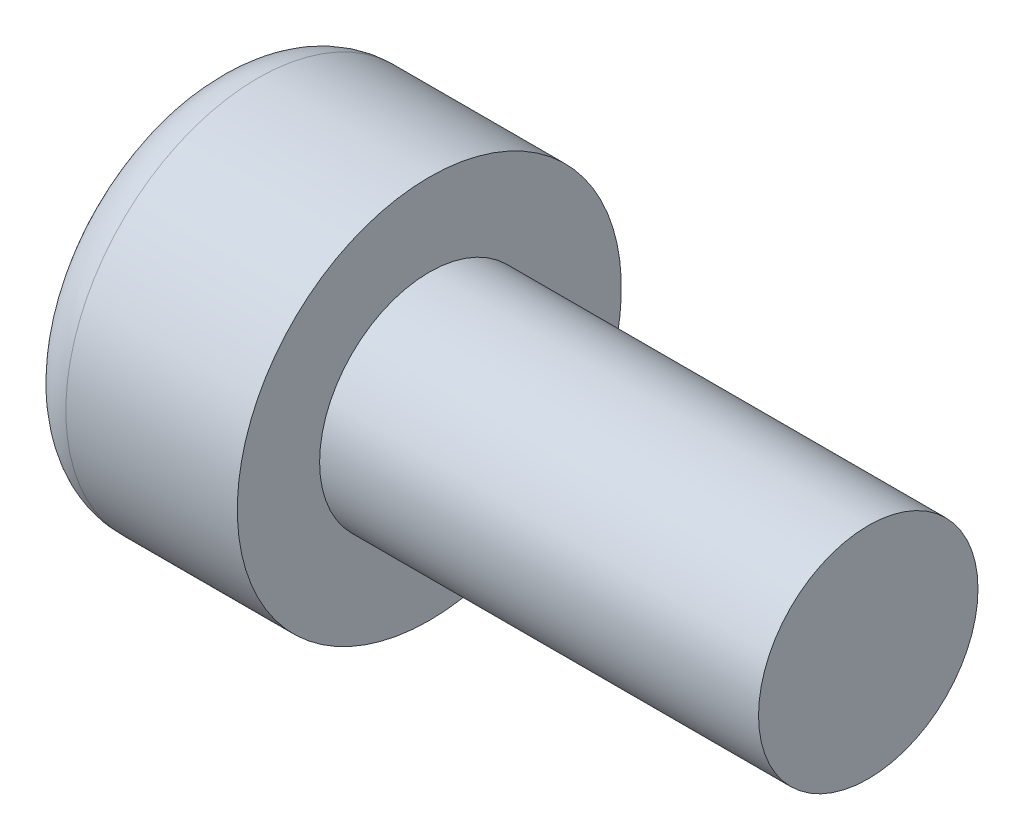
ISO-10303-21;
HEADER;
FILE_DESCRIPTION(('STEP AP214'),'2;1');
FILE_NAME('part.step','',(''),(''),'','','');
FILE_SCHEMA(('AUTOMOTIVE_DESIGN { 1 0 10303 214 1 1 1 1 }'));
ENDSEC;
DATA;
#1=APPLICATION_CONTEXT('core data for automotive mechanical design processes');
#2=APPLICATION_PROTOCOL_DEFINITION('international standard','automotive_design',2000,#1);
#3=PRODUCT_CONTEXT('',#1,'mechanical');
#4=PRODUCT('Part','Part','',(#3));
#5=PRODUCT_RELATED_PRODUCT_CATEGORY('part','',(#4));
#6=PRODUCT_DEFINITION_FORMATION('','',#4);
#7=PRODUCT_DEFINITION_CONTEXT('part definition',#1,'design');
#8=PRODUCT_DEFINITION('design','',#6,#7);
#9=PRODUCT_DEFINITION_SHAPE('','',#8);
#10=(LENGTH_UNIT() NAMED_UNIT(*) SI_UNIT(.MILLI.,.METRE.));
#11=(NAMED_UNIT(*) PLANE_ANGLE_UNIT() SI_UNIT($,.RADIAN.));
#12=(NAMED_UNIT(*) SI_UNIT($,.STERADIAN.) SOLID_ANGLE_UNIT());
#13=UNCERTAINTY_MEASURE_WITH_UNIT(LENGTH_MEASURE(1.E-05),#10,'distance_accuracy_value','');
#14=(GEOMETRIC_REPRESENTATION_CONTEXT(3) GLOBAL_UNCERTAINTY_ASSIGNED_CONTEXT((#13)) GLOBAL_UNIT_ASSIGNED_CONTEXT((#10,
#11,#12)) REPRESENTATION_CONTEXT('',''));
#15=CARTESIAN_POINT('',(0.,0.,0.));
#16=DIRECTION('',(0.,0.,1.));
#17=DIRECTION('',(1.,0.,0.));
#18=AXIS2_PLACEMENT_3D('',#15,#16,#17);
#19=CARTESIAN_POINT('',(0.,0.,0.));
#20=DIRECTION('',(1.,0.,0.));
#21=DIRECTION('',(0.,1.,0.));
#22=AXIS2_PLACEMENT_3D('',#19,#20,#21);
#23=PLANE('',#22);
#24=DIRECTION('',(0.,-0.5,-0.866025403784439));
#25=VECTOR('',#24,1.);
#26=CARTESIAN_POINT('',(0.,1.73205080756888,0.));
#27=LINE('',#26,#25);
#28=CARTESIAN_POINT('',(0.,1.73205080756888,0.));
#29=VERTEX_POINT('',#28);
#30=CARTESIAN_POINT('',(0.,0.866025403784439,-1.5));
#31=VERTEX_POINT('',#30);
#32=EDGE_CURVE('E121',#29,#31,#27,.T.);
#33=ORIENTED_EDGE('',*,*,#32,.F.);
#34=DIRECTION('',(0.,0.5,-0.866025403784439));
#35=VECTOR('',#34,1.);
#36=CARTESIAN_POINT('',(0.,0.866025403784439,1.5));
#37=LINE('',#36,#35);
#38=CARTESIAN_POINT('',(0.,0.866025403784439,1.5));
#39=VERTEX_POINT('',#38);
#40=EDGE_CURVE('E47',#39,#29,#37,.T.);
#41=ORIENTED_EDGE('',*,*,#40,.F.);
#42=DIRECTION('',(0.,1.,0.));
#43=VECTOR('',#42,1.);
#44=CARTESIAN_POINT('',(0.,-0.866025403784439,1.5));
#45=LINE('',#44,#43);
#46=CARTESIAN_POINT('',(0.,-0.866025403784439,1.5));
#47=VERTEX_POINT('',#46);
#48=EDGE_CURVE('E130',#47,#39,#45,.T.);
#49=ORIENTED_EDGE('',*,*,#48,.F.);
#50=DIRECTION('',(0.,0.5,0.866025403784439));
#51=VECTOR('',#50,1.);
#52=CARTESIAN_POINT('',(0.,-1.73205080756888,0.));
#53=LINE('',#52,#51);
#54=CARTESIAN_POINT('',(0.,-1.73205080756888,0.));
#55=VERTEX_POINT('',#54);
#56=EDGE_CURVE('E128',#55,#47,#53,.T.);
#57=ORIENTED_EDGE('',*,*,#56,.F.);
#58=DIRECTION('',(0.,-0.5,0.866025403784439));
#59=VECTOR('',#58,1.);
#60=CARTESIAN_POINT('',(0.,-0.866025403784439,-1.5));
#61=LINE('',#60,#59);
#62=CARTESIAN_POINT('',(0.,-0.866025403784439,-1.5));
#63=VERTEX_POINT('',#62);
#64=EDGE_CURVE('E95',#63,#55,#61,.T.);
#65=ORIENTED_EDGE('',*,*,#64,.F.);
#66=DIRECTION('',(0.,-1.,0.));
#67=VECTOR('',#66,1.);
#68=CARTESIAN_POINT('',(0.,0.866025403784439,-1.5));
#69=LINE('',#68,#67);
#70=EDGE_CURVE('E124',#31,#63,#69,.T.);
#71=ORIENTED_EDGE('',*,*,#70,.F.);
#72=EDGE_LOOP('',(#33,#41,#49,#57,#65,#71));
#73=FACE_BOUND('',#72,.T.);
#74=CARTESIAN_POINT('',(0.,0.,0.));
#75=DIRECTION('',(-1.,0.,0.));
#76=DIRECTION('',(0.,-1.,0.));
#77=AXIS2_PLACEMENT_3D('',#74,#75,#76);
#78=CIRCLE('',#77,2.625);
#79=CARTESIAN_POINT('',(0.,-2.625,0.));
#80=VERTEX_POINT('',#79);
#81=EDGE_CURVE('E11',#80,#80,#78,.T.);
#82=ORIENTED_EDGE('',*,*,#81,.T.);
#83=EDGE_LOOP('',(#82));
#84=FACE_BOUND('',#83,.T.);
#85=ADVANCED_FACE('F33',(#73,#84),#23,.F.);
#86=CARTESIAN_POINT('',(0.875,0.,0.));
#87=DIRECTION('',(-1.,0.,0.));
#88=DIRECTION('',(0.,-1.,0.));
#89=AXIS2_PLACEMENT_3D('',#86,#87,#88);
#90=TOROIDAL_SURFACE('',#89,2.625,0.875);
#91=ORIENTED_EDGE('',*,*,#81,.F.);
#92=EDGE_LOOP('',(#91));
#93=FACE_BOUND('',#92,.T.);
#94=CARTESIAN_POINT('',(0.875,0.,0.));
#95=DIRECTION('',(-1.,0.,0.));
#96=DIRECTION('',(0.,-1.,0.));
#97=AXIS2_PLACEMENT_3D('',#94,#95,#96);
#98=CIRCLE('',#97,3.5);
#99=CARTESIAN_POINT('',(0.875000000000001,-3.5,0.));
#100=VERTEX_POINT('',#99);
#101=EDGE_CURVE('E40',#100,#100,#98,.T.);
#102=ORIENTED_EDGE('',*,*,#101,.T.);
#103=EDGE_LOOP('',(#102));
#104=FACE_BOUND('',#103,.T.);
#105=ADVANCED_FACE('F150',(#93,#104),#90,.T.);
#106=CARTESIAN_POINT('',(0.,0.,0.));
#107=DIRECTION('',(-1.,0.,0.));
#108=DIRECTION('',(0.,-1.,0.));
#109=AXIS2_PLACEMENT_3D('',#106,#107,#108);
#110=CYLINDRICAL_SURFACE('',#109,3.5);
#111=ORIENTED_EDGE('',*,*,#101,.F.);
#112=EDGE_LOOP('',(#111));
#113=FACE_BOUND('',#112,.T.);
#114=CARTESIAN_POINT('',(4.,0.,0.));
#115=DIRECTION('',(-1.,0.,0.));
#116=DIRECTION('',(0.,-1.,0.));
#117=AXIS2_PLACEMENT_3D('',#114,#115,#116);
#118=CIRCLE('',#117,3.5);
#119=CARTESIAN_POINT('',(4.,-3.5,0.));
#120=VERTEX_POINT('',#119);
#121=EDGE_CURVE('E145',#120,#120,#118,.T.);
#122=ORIENTED_EDGE('',*,*,#121,.T.);
#123=EDGE_LOOP('',(#122));
#124=FACE_BOUND('',#123,.T.);
#125=ADVANCED_FACE('F152',(#113,#124),#110,.T.);
#126=CARTESIAN_POINT('',(4.,3.5,0.));
#127=DIRECTION('',(-1.,0.,0.));
#128=DIRECTION('',(0.,-1.,0.));
#129=AXIS2_PLACEMENT_3D('',#126,#127,#128);
#130=PLANE('',#129);
#131=ORIENTED_EDGE('',*,*,#121,.F.);
#132=EDGE_LOOP('',(#131));
#133=FACE_BOUND('',#132,.T.);
#134=CARTESIAN_POINT('',(4.,0.,0.));
#135=DIRECTION('',(-1.,0.,0.));
#136=DIRECTION('',(0.,-1.,0.));
#137=AXIS2_PLACEMENT_3D('',#134,#135,#136);
#138=CIRCLE('',#137,2.);
#139=CARTESIAN_POINT('',(4.,-2.,0.));
#140=VERTEX_POINT('',#139);
#141=EDGE_CURVE('E142',#140,#140,#138,.T.);
#142=ORIENTED_EDGE('',*,*,#141,.T.);
#143=EDGE_LOOP('',(#142));
#144=FACE_BOUND('',#143,.T.);
#145=ADVANCED_FACE('F155',(#133,#144),#130,.F.);
#146=CARTESIAN_POINT('',(0.,0.,0.));
#147=DIRECTION('',(-1.,0.,0.));
#148=DIRECTION('',(0.,-1.,0.));
#149=AXIS2_PLACEMENT_3D('',#146,#147,#148);
#150=CYLINDRICAL_SURFACE('',#149,2.);
#151=ORIENTED_EDGE('',*,*,#141,.F.);
#152=EDGE_LOOP('',(#151));
#153=FACE_BOUND('',#152,.T.);
#154=CARTESIAN_POINT('',(12.,0.,0.));
#155=DIRECTION('',(-1.,0.,0.));
#156=DIRECTION('',(0.,-1.,0.));
#157=AXIS2_PLACEMENT_3D('',#154,#155,#156);
#158=CIRCLE('',#157,2.);
#159=CARTESIAN_POINT('',(12.,-2.,0.));
#160=VERTEX_POINT('',#159);
#161=EDGE_CURVE('E134',#160,#160,#158,.T.);
#162=ORIENTED_EDGE('',*,*,#161,.T.);
#163=EDGE_LOOP('',(#162));
#164=FACE_BOUND('',#163,.T.);
#165=ADVANCED_FACE('F161',(#153,#164),#150,.T.);
#166=CARTESIAN_POINT('',(12.,2.,0.));
#167=DIRECTION('',(-1.,0.,0.));
#168=DIRECTION('',(0.,-1.,0.));
#169=AXIS2_PLACEMENT_3D('',#166,#167,#168);
#170=PLANE('',#169);
#171=ORIENTED_EDGE('',*,*,#161,.F.);
#172=EDGE_LOOP('',(#171));
#173=FACE_BOUND('',#172,.T.);
#174=ADVANCED_FACE('F167',(#173),#170,.F.);
#175=CARTESIAN_POINT('',(2.,0.866025403784439,1.5));
#176=DIRECTION('',(0.,0.866025403784439,0.5));
#177=DIRECTION('',(0.,-0.5,0.866025403784439));
#178=AXIS2_PLACEMENT_3D('',#175,#176,#177);
#179=PLANE('',#178);
#180=ORIENTED_EDGE('',*,*,#40,.T.);
#181=DIRECTION('',(-1.,0.,0.));
#182=VECTOR('',#181,1.);
#183=CARTESIAN_POINT('',(2.,1.73205080756888,0.));
#184=LINE('',#183,#182);
#185=CARTESIAN_POINT('',(2.,1.73205080756888,0.));
#186=VERTEX_POINT('',#185);
#187=EDGE_CURVE('E77',#186,#29,#184,.T.);
#188=ORIENTED_EDGE('',*,*,#187,.F.);
#189=DIRECTION('',(0.,0.5,-0.866025403784439));
#190=VECTOR('',#189,1.);
#191=CARTESIAN_POINT('',(2.,0.866025403784439,1.5));
#192=LINE('',#191,#190);
#193=CARTESIAN_POINT('',(2.,0.866025403784439,1.5));
#194=VERTEX_POINT('',#193);
#195=EDGE_CURVE('E132',#194,#186,#192,.T.);
#196=ORIENTED_EDGE('',*,*,#195,.F.);
#197=DIRECTION('',(-1.,0.,0.));
#198=VECTOR('',#197,1.);
#199=CARTESIAN_POINT('',(2.,0.866025403784439,1.5));
#200=LINE('',#199,#198);
#201=EDGE_CURVE('E55',#194,#39,#200,.T.);
#202=ORIENTED_EDGE('',*,*,#201,.T.);
#203=EDGE_LOOP('',(#180,#188,#196,#202));
#204=FACE_BOUND('',#203,.T.);
#205=ADVANCED_FACE('F172',(#204),#179,.F.);
#206=CARTESIAN_POINT('',(2.,-0.866025403784439,1.5));
#207=DIRECTION('',(0.,0.,1.));
#208=DIRECTION('',(0.,-1.,0.));
#209=AXIS2_PLACEMENT_3D('',#206,#207,#208);
#210=PLANE('',#209);
#211=ORIENTED_EDGE('',*,*,#48,.T.);
#212=ORIENTED_EDGE('',*,*,#201,.F.);
#213=DIRECTION('',(0.,1.,0.));
#214=VECTOR('',#213,1.);
#215=CARTESIAN_POINT('',(2.,-0.866025403784439,1.5));
#216=LINE('',#215,#214);
#217=CARTESIAN_POINT('',(2.,-0.866025403784439,1.5));
#218=VERTEX_POINT('',#217);
#219=EDGE_CURVE('E107',#218,#194,#216,.T.);
#220=ORIENTED_EDGE('',*,*,#219,.F.);
#221=DIRECTION('',(-1.,0.,0.));
#222=VECTOR('',#221,1.);
#223=CARTESIAN_POINT('',(2.,-0.866025403784439,1.5));
#224=LINE('',#223,#222);
#225=EDGE_CURVE('E99',#218,#47,#224,.T.);
#226=ORIENTED_EDGE('',*,*,#225,.T.);
#227=EDGE_LOOP('',(#211,#212,#220,#226));
#228=FACE_BOUND('',#227,.T.);
#229=ADVANCED_FACE('F177',(#228),#210,.F.);
#230=CARTESIAN_POINT('',(2.,-1.73205080756888,0.));
#231=DIRECTION('',(0.,-0.866025403784439,0.5));
#232=DIRECTION('',(0.,-0.5,-0.866025403784439));
#233=AXIS2_PLACEMENT_3D('',#230,#231,#232);
#234=PLANE('',#233);
#235=ORIENTED_EDGE('',*,*,#56,.T.);
#236=ORIENTED_EDGE('',*,*,#225,.F.);
#237=DIRECTION('',(0.,0.5,0.866025403784439));
#238=VECTOR('',#237,1.);
#239=CARTESIAN_POINT('',(2.,-1.73205080756888,0.));
#240=LINE('',#239,#238);
#241=CARTESIAN_POINT('',(2.,-1.73205080756888,0.));
#242=VERTEX_POINT('',#241);
#243=EDGE_CURVE('E103',#242,#218,#240,.T.);
#244=ORIENTED_EDGE('',*,*,#243,.F.);
#245=DIRECTION('',(-1.,0.,0.));
#246=VECTOR('',#245,1.);
#247=CARTESIAN_POINT('',(2.,-1.73205080756888,0.));
#248=LINE('',#247,#246);
#249=EDGE_CURVE('E88',#242,#55,#248,.T.);
#250=ORIENTED_EDGE('',*,*,#249,.T.);
#251=EDGE_LOOP('',(#235,#236,#244,#250));
#252=FACE_BOUND('',#251,.T.);
#253=ADVANCED_FACE('F104',(#252),#234,.F.);
#254=CARTESIAN_POINT('',(2.,-0.866025403784439,-1.5));
#255=DIRECTION('',(0.,-0.866025403784439,-0.5));
#256=DIRECTION('',(0.,0.5,-0.866025403784439));
#257=AXIS2_PLACEMENT_3D('',#254,#255,#256);
#258=PLANE('',#257);
#259=ORIENTED_EDGE('',*,*,#64,.T.);
#260=ORIENTED_EDGE('',*,*,#249,.F.);
#261=DIRECTION('',(0.,-0.5,0.866025403784439));
#262=VECTOR('',#261,1.);
#263=CARTESIAN_POINT('',(2.,-0.866025403784439,-1.5));
#264=LINE('',#263,#262);
#265=CARTESIAN_POINT('',(2.,-0.866025403784439,-1.5));
#266=VERTEX_POINT('',#265);
#267=EDGE_CURVE('E92',#266,#242,#264,.T.);
#268=ORIENTED_EDGE('',*,*,#267,.F.);
#269=DIRECTION('',(-1.,0.,0.));
#270=VECTOR('',#269,1.);
#271=CARTESIAN_POINT('',(2.,-0.866025403784439,-1.5));
#272=LINE('',#271,#270);
#273=EDGE_CURVE('E100',#266,#63,#272,.T.);
#274=ORIENTED_EDGE('',*,*,#273,.T.);
#275=EDGE_LOOP('',(#259,#260,#268,#274));
#276=FACE_BOUND('',#275,.T.);
#277=ADVANCED_FACE('F90',(#276),#258,.F.);
#278=CARTESIAN_POINT('',(2.,0.866025403784439,-1.5));
#279=DIRECTION('',(0.,0.,-1.));
#280=DIRECTION('',(-1.,0.,0.));
#281=AXIS2_PLACEMENT_3D('',#278,#279,#280);
#282=PLANE('',#281);
#283=ORIENTED_EDGE('',*,*,#70,.T.);
#284=ORIENTED_EDGE('',*,*,#273,.F.);
#285=DIRECTION('',(0.,-1.,0.));
#286=VECTOR('',#285,1.);
#287=CARTESIAN_POINT('',(2.,0.866025403784439,-1.5));
#288=LINE('',#287,#286);
#289=CARTESIAN_POINT('',(2.,0.866025403784439,-1.5));
#290=VERTEX_POINT('',#289);
#291=EDGE_CURVE('E113',#290,#266,#288,.T.);
#292=ORIENTED_EDGE('',*,*,#291,.F.);
#293=DIRECTION('',(-1.,0.,0.));
#294=VECTOR('',#293,1.);
#295=CARTESIAN_POINT('',(2.,0.866025403784439,-1.5));
#296=LINE('',#295,#294);
#297=EDGE_CURVE('E137',#290,#31,#296,.T.);
#298=ORIENTED_EDGE('',*,*,#297,.T.);
#299=EDGE_LOOP('',(#283,#284,#292,#298));
#300=FACE_BOUND('',#299,.T.);
#301=ADVANCED_FACE('F203',(#300),#282,.F.);
#302=CARTESIAN_POINT('',(2.,1.73205080756888,0.));
#303=DIRECTION('',(0.,0.866025403784439,-0.5));
#304=DIRECTION('',(0.,0.5,0.866025403784439));
#305=AXIS2_PLACEMENT_3D('',#302,#303,#304);
#306=PLANE('',#305);
#307=ORIENTED_EDGE('',*,*,#32,.T.);
#308=ORIENTED_EDGE('',*,*,#297,.F.);
#309=DIRECTION('',(0.,-0.5,-0.866025403784439));
#310=VECTOR('',#309,1.);
#311=CARTESIAN_POINT('',(2.,1.73205080756888,0.));
#312=LINE('',#311,#310);
#313=EDGE_CURVE('E115',#186,#290,#312,.T.);
#314=ORIENTED_EDGE('',*,*,#313,.F.);
#315=ORIENTED_EDGE('',*,*,#187,.T.);
#316=EDGE_LOOP('',(#307,#308,#314,#315));
#317=FACE_BOUND('',#316,.T.);
#318=ADVANCED_FACE('F191',(#317),#306,.F.);
#319=CARTESIAN_POINT('',(2.,0.,0.));
#320=DIRECTION('',(-1.,0.,0.));
#321=DIRECTION('',(0.,-1.,0.));
#322=AXIS2_PLACEMENT_3D('',#319,#320,#321);
#323=PLANE('',#322);
#324=ORIENTED_EDGE('',*,*,#195,.T.);
#325=ORIENTED_EDGE('',*,*,#313,.T.);
#326=ORIENTED_EDGE('',*,*,#291,.T.);
#327=ORIENTED_EDGE('',*,*,#267,.T.);
#328=ORIENTED_EDGE('',*,*,#243,.T.);
#329=ORIENTED_EDGE('',*,*,#219,.T.);
#330=EDGE_LOOP('',(#324,#325,#326,#327,#328,#329));
#331=FACE_BOUND('',#330,.T.);
#332=ADVANCED_FACE('F110',(#331),#323,.T.);
#333=CLOSED_SHELL('',(#85,#105,#125,#145,#165,#174,#205,#229,#253,#277,#301,#318,#332));
#334=MANIFOLD_SOLID_BREP('B2',#333);
#335=ADVANCED_BREP_SHAPE_REPRESENTATION('',(#18,#334),#14);
#336=SHAPE_DEFINITION_REPRESENTATION(#9,#335);
ENDSEC;
END-ISO-10303-21;
